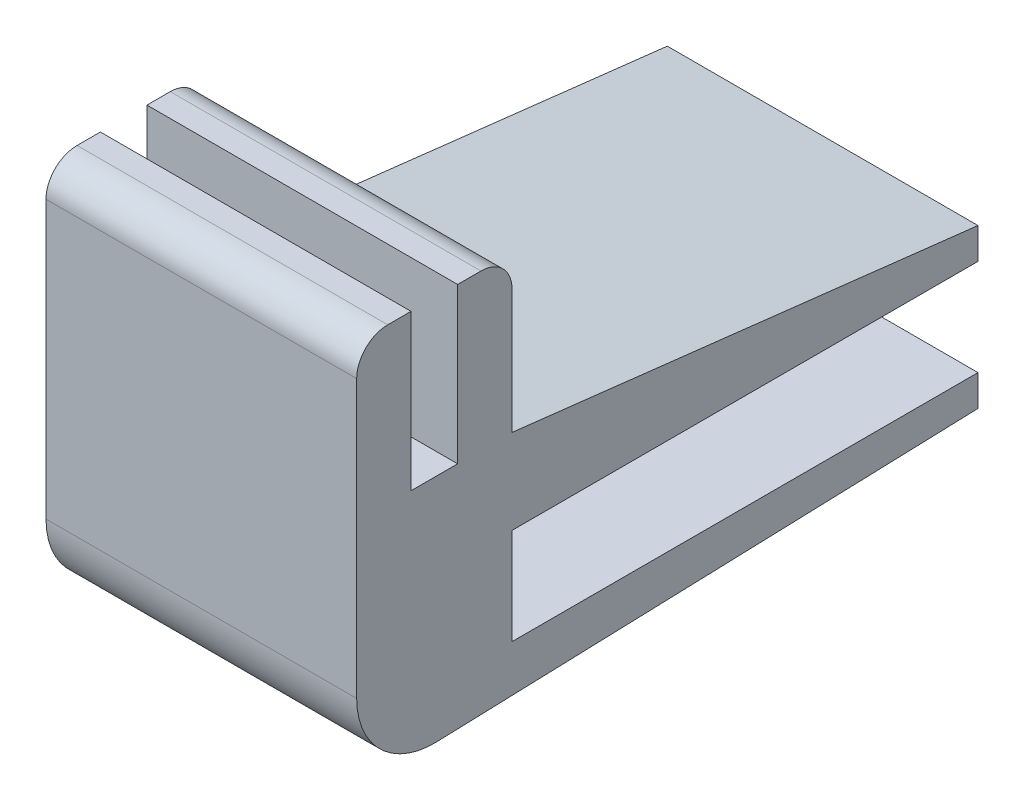
ISO-10303-21;
HEADER;
FILE_DESCRIPTION(('STEP AP214'),'2;1');
FILE_NAME('part.step','',(''),(''),'','','');
FILE_SCHEMA(('AUTOMOTIVE_DESIGN { 1 0 10303 214 1 1 1 1 }'));
ENDSEC;
DATA;
#1=APPLICATION_CONTEXT('core data for automotive mechanical design processes');
#2=APPLICATION_PROTOCOL_DEFINITION('international standard','automotive_design',2000,#1);
#3=PRODUCT_CONTEXT('',#1,'mechanical');
#4=PRODUCT('Part','Part','',(#3));
#5=PRODUCT_RELATED_PRODUCT_CATEGORY('part','',(#4));
#6=PRODUCT_DEFINITION_FORMATION('','',#4);
#7=PRODUCT_DEFINITION_CONTEXT('part definition',#1,'design');
#8=PRODUCT_DEFINITION('design','',#6,#7);
#9=PRODUCT_DEFINITION_SHAPE('','',#8);
#10=(LENGTH_UNIT() NAMED_UNIT(*) SI_UNIT(.MILLI.,.METRE.));
#11=(NAMED_UNIT(*) PLANE_ANGLE_UNIT() SI_UNIT($,.RADIAN.));
#12=(NAMED_UNIT(*) SI_UNIT($,.STERADIAN.) SOLID_ANGLE_UNIT());
#13=UNCERTAINTY_MEASURE_WITH_UNIT(LENGTH_MEASURE(1.E-05),#10,'distance_accuracy_value','');
#14=(GEOMETRIC_REPRESENTATION_CONTEXT(3) GLOBAL_UNCERTAINTY_ASSIGNED_CONTEXT((#13)) GLOBAL_UNIT_ASSIGNED_CONTEXT((#10,
#11,#12)) REPRESENTATION_CONTEXT('',''));
#15=CARTESIAN_POINT('',(0.,0.,0.));
#16=DIRECTION('',(0.,0.,1.));
#17=DIRECTION('',(1.,0.,0.));
#18=AXIS2_PLACEMENT_3D('',#15,#16,#17);
#19=CARTESIAN_POINT('',(20.,1.33556237081525,-40.));
#20=DIRECTION('',(0.,0.,1.));
#21=DIRECTION('',(1.,0.,0.));
#22=AXIS2_PLACEMENT_3D('',#19,#20,#21);
#23=PLANE('',#22);
#24=DIRECTION('',(0.,1.,0.));
#25=VECTOR('',#24,1.);
#26=CARTESIAN_POINT('',(0.,1.33556237081525,-40.));
#27=LINE('',#26,#25);
#28=CARTESIAN_POINT('',(0.,1.33556237081525,-40.));
#29=VERTEX_POINT('',#28);
#30=CARTESIAN_POINT('',(0.,3.33556237081525,-40.));
#31=VERTEX_POINT('',#30);
#32=EDGE_CURVE('E181',#29,#31,#27,.T.);
#33=ORIENTED_EDGE('',*,*,#32,.T.);
#34=DIRECTION('',(-1.,0.,0.));
#35=VECTOR('',#34,1.);
#36=CARTESIAN_POINT('',(20.,3.33556237081525,-40.));
#37=LINE('',#36,#35);
#38=CARTESIAN_POINT('',(20.,3.33556237081525,-40.));
#39=VERTEX_POINT('',#38);
#40=EDGE_CURVE('E11',#39,#31,#37,.T.);
#41=ORIENTED_EDGE('',*,*,#40,.F.);
#42=DIRECTION('',(0.,1.,0.));
#43=VECTOR('',#42,1.);
#44=CARTESIAN_POINT('',(20.,1.33556237081525,-40.));
#45=LINE('',#44,#43);
#46=CARTESIAN_POINT('',(20.,1.33556237081525,-40.));
#47=VERTEX_POINT('',#46);
#48=EDGE_CURVE('E214',#47,#39,#45,.T.);
#49=ORIENTED_EDGE('',*,*,#48,.F.);
#50=DIRECTION('',(-1.,0.,0.));
#51=VECTOR('',#50,1.);
#52=CARTESIAN_POINT('',(20.,1.33556237081525,-40.));
#53=LINE('',#52,#51);
#54=EDGE_CURVE('E177',#47,#29,#53,.T.);
#55=ORIENTED_EDGE('',*,*,#54,.T.);
#56=EDGE_LOOP('',(#33,#41,#49,#55));
#57=FACE_BOUND('',#56,.T.);
#58=ADVANCED_FACE('F32',(#57),#23,.F.);
#59=CARTESIAN_POINT('',(20.,3.33556237081525,-40.));
#60=DIRECTION('',(0.,-1.,0.));
#61=DIRECTION('',(0.,0.,-1.));
#62=AXIS2_PLACEMENT_3D('',#59,#60,#61);
#63=PLANE('',#62);
#64=DIRECTION('',(0.,0.,1.));
#65=VECTOR('',#64,1.);
#66=CARTESIAN_POINT('',(0.,3.33556237081525,-40.));
#67=LINE('',#66,#65);
#68=CARTESIAN_POINT('',(0.,3.33556237081524,-10.));
#69=VERTEX_POINT('',#68);
#70=EDGE_CURVE('E184',#31,#69,#67,.T.);
#71=ORIENTED_EDGE('',*,*,#70,.T.);
#72=DIRECTION('',(-1.,0.,0.));
#73=VECTOR('',#72,1.);
#74=CARTESIAN_POINT('',(20.,3.33556237081524,-10.));
#75=LINE('',#74,#73);
#76=CARTESIAN_POINT('',(20.,3.33556237081524,-10.));
#77=VERTEX_POINT('',#76);
#78=EDGE_CURVE('E40',#77,#69,#75,.T.);
#79=ORIENTED_EDGE('',*,*,#78,.F.);
#80=DIRECTION('',(0.,0.,1.));
#81=VECTOR('',#80,1.);
#82=CARTESIAN_POINT('',(20.,3.33556237081525,-40.));
#83=LINE('',#82,#81);
#84=EDGE_CURVE('E118',#39,#77,#83,.T.);
#85=ORIENTED_EDGE('',*,*,#84,.F.);
#86=ORIENTED_EDGE('',*,*,#40,.T.);
#87=EDGE_LOOP('',(#71,#79,#85,#86));
#88=FACE_BOUND('',#87,.T.);
#89=ADVANCED_FACE('F318',(#88),#63,.F.);
#90=CARTESIAN_POINT('',(20.,3.33556237081524,-10.));
#91=DIRECTION('',(0.,0.,1.));
#92=DIRECTION('',(1.,0.,0.));
#93=AXIS2_PLACEMENT_3D('',#90,#91,#92);
#94=PLANE('',#93);
#95=DIRECTION('',(0.,1.,0.));
#96=VECTOR('',#95,1.);
#97=CARTESIAN_POINT('',(0.,3.33556237081524,-10.));
#98=LINE('',#97,#96);
#99=CARTESIAN_POINT('',(0.,9.53556237081524,-10.));
#100=VERTEX_POINT('',#99);
#101=EDGE_CURVE('E186',#69,#100,#98,.T.);
#102=ORIENTED_EDGE('',*,*,#101,.T.);
#103=DIRECTION('',(-1.,0.,0.));
#104=VECTOR('',#103,1.);
#105=CARTESIAN_POINT('',(20.,9.53556237081524,-10.));
#106=LINE('',#105,#104);
#107=CARTESIAN_POINT('',(20.,9.53556237081524,-10.));
#108=VERTEX_POINT('',#107);
#109=EDGE_CURVE('E248',#108,#100,#106,.T.);
#110=ORIENTED_EDGE('',*,*,#109,.F.);
#111=DIRECTION('',(0.,1.,0.));
#112=VECTOR('',#111,1.);
#113=CARTESIAN_POINT('',(20.,3.33556237081524,-10.));
#114=LINE('',#113,#112);
#115=EDGE_CURVE('E256',#77,#108,#114,.T.);
#116=ORIENTED_EDGE('',*,*,#115,.F.);
#117=ORIENTED_EDGE('',*,*,#78,.T.);
#118=EDGE_LOOP('',(#102,#110,#116,#117));
#119=FACE_BOUND('',#118,.T.);
#120=ADVANCED_FACE('F254',(#119),#94,.F.);
#121=CARTESIAN_POINT('',(20.,9.53556237081524,-10.));
#122=DIRECTION('',(0.,1.,0.));
#123=DIRECTION('',(0.,0.,1.));
#124=AXIS2_PLACEMENT_3D('',#121,#122,#123);
#125=PLANE('',#124);
#126=DIRECTION('',(0.,0.,-1.));
#127=VECTOR('',#126,1.);
#128=CARTESIAN_POINT('',(0.,9.53556237081524,-10.));
#129=LINE('',#128,#127);
#130=CARTESIAN_POINT('',(0.,9.53556237081525,-40.));
#131=VERTEX_POINT('',#130);
#132=EDGE_CURVE('E188',#100,#131,#129,.T.);
#133=ORIENTED_EDGE('',*,*,#132,.T.);
#134=DIRECTION('',(-1.,0.,0.));
#135=VECTOR('',#134,1.);
#136=CARTESIAN_POINT('',(20.,9.53556237081525,-40.));
#137=LINE('',#136,#135);
#138=CARTESIAN_POINT('',(20.,9.53556237081525,-40.));
#139=VERTEX_POINT('',#138);
#140=EDGE_CURVE('E245',#139,#131,#137,.T.);
#141=ORIENTED_EDGE('',*,*,#140,.F.);
#142=DIRECTION('',(0.,0.,-1.));
#143=VECTOR('',#142,1.);
#144=CARTESIAN_POINT('',(20.,9.53556237081524,-10.));
#145=LINE('',#144,#143);
#146=EDGE_CURVE('E274',#108,#139,#145,.T.);
#147=ORIENTED_EDGE('',*,*,#146,.F.);
#148=ORIENTED_EDGE('',*,*,#109,.T.);
#149=EDGE_LOOP('',(#133,#141,#147,#148));
#150=FACE_BOUND('',#149,.T.);
#151=ADVANCED_FACE('F265',(#150),#125,.F.);
#152=CARTESIAN_POINT('',(20.,9.53556237081525,-40.));
#153=DIRECTION('',(0.,0.,1.));
#154=DIRECTION('',(1.,0.,0.));
#155=AXIS2_PLACEMENT_3D('',#152,#153,#154);
#156=PLANE('',#155);
#157=DIRECTION('',(0.,1.,0.));
#158=VECTOR('',#157,1.);
#159=CARTESIAN_POINT('',(0.,9.53556237081525,-40.));
#160=LINE('',#159,#158);
#161=CARTESIAN_POINT('',(0.,11.5355623708152,-40.));
#162=VERTEX_POINT('',#161);
#163=EDGE_CURVE('E190',#131,#162,#160,.T.);
#164=ORIENTED_EDGE('',*,*,#163,.T.);
#165=DIRECTION('',(-1.,0.,0.));
#166=VECTOR('',#165,1.);
#167=CARTESIAN_POINT('',(20.,11.5355623708152,-40.));
#168=LINE('',#167,#166);
#169=CARTESIAN_POINT('',(20.,11.5355623708152,-40.));
#170=VERTEX_POINT('',#169);
#171=EDGE_CURVE('E242',#170,#162,#168,.T.);
#172=ORIENTED_EDGE('',*,*,#171,.F.);
#173=DIRECTION('',(0.,1.,0.));
#174=VECTOR('',#173,1.);
#175=CARTESIAN_POINT('',(20.,9.53556237081525,-40.));
#176=LINE('',#175,#174);
#177=EDGE_CURVE('E271',#139,#170,#176,.T.);
#178=ORIENTED_EDGE('',*,*,#177,.F.);
#179=ORIENTED_EDGE('',*,*,#140,.T.);
#180=EDGE_LOOP('',(#164,#172,#178,#179));
#181=FACE_BOUND('',#180,.T.);
#182=ADVANCED_FACE('F269',(#181),#156,.F.);
#183=CARTESIAN_POINT('',(20.,15.,-10.));
#184=DIRECTION('',(0.,-0.993397999862923,0.1147188470494));
#185=DIRECTION('',(0.,-0.1147188470494,-0.993397999862923));
#186=AXIS2_PLACEMENT_3D('',#183,#184,#185);
#187=PLANE('',#186);
#188=DIRECTION('',(0.,0.1147188470494,0.993397999862923));
#189=VECTOR('',#188,1.);
#190=CARTESIAN_POINT('',(0.,15.,-10.));
#191=LINE('',#190,#189);
#192=CARTESIAN_POINT('',(0.,15.,-10.));
#193=VERTEX_POINT('',#192);
#194=EDGE_CURVE('E192',#162,#193,#191,.T.);
#195=ORIENTED_EDGE('',*,*,#194,.T.);
#196=DIRECTION('',(-1.,0.,0.));
#197=VECTOR('',#196,1.);
#198=CARTESIAN_POINT('',(20.,15.,-10.));
#199=LINE('',#198,#197);
#200=CARTESIAN_POINT('',(20.,15.,-10.));
#201=VERTEX_POINT('',#200);
#202=EDGE_CURVE('E239',#201,#193,#199,.T.);
#203=ORIENTED_EDGE('',*,*,#202,.F.);
#204=DIRECTION('',(0.,0.1147188470494,0.993397999862923));
#205=VECTOR('',#204,1.);
#206=CARTESIAN_POINT('',(20.,15.,-10.));
#207=LINE('',#206,#205);
#208=EDGE_CURVE('E273',#170,#201,#207,.T.);
#209=ORIENTED_EDGE('',*,*,#208,.F.);
#210=ORIENTED_EDGE('',*,*,#171,.T.);
#211=EDGE_LOOP('',(#195,#203,#209,#210));
#212=FACE_BOUND('',#211,.T.);
#213=ADVANCED_FACE('F331',(#212),#187,.F.);
#214=CARTESIAN_POINT('',(20.,15.,-10.));
#215=DIRECTION('',(0.,0.,1.));
#216=DIRECTION('',(1.,0.,0.));
#217=AXIS2_PLACEMENT_3D('',#214,#215,#216);
#218=PLANE('',#217);
#219=DIRECTION('',(0.,1.,0.));
#220=VECTOR('',#219,1.);
#221=CARTESIAN_POINT('',(0.,15.,-10.));
#222=LINE('',#221,#220);
#223=CARTESIAN_POINT('',(0.,23.,-10.));
#224=VERTEX_POINT('',#223);
#225=EDGE_CURVE('E194',#193,#224,#222,.T.);
#226=ORIENTED_EDGE('',*,*,#225,.T.);
#227=DIRECTION('',(-1.,0.,0.));
#228=VECTOR('',#227,1.);
#229=CARTESIAN_POINT('',(20.,23.,-10.));
#230=LINE('',#229,#228);
#231=CARTESIAN_POINT('',(20.,23.,-10.));
#232=VERTEX_POINT('',#231);
#233=EDGE_CURVE('E236',#232,#224,#230,.T.);
#234=ORIENTED_EDGE('',*,*,#233,.F.);
#235=DIRECTION('',(0.,1.,0.));
#236=VECTOR('',#235,1.);
#237=CARTESIAN_POINT('',(20.,15.,-10.));
#238=LINE('',#237,#236);
#239=EDGE_CURVE('E276',#201,#232,#238,.T.);
#240=ORIENTED_EDGE('',*,*,#239,.F.);
#241=ORIENTED_EDGE('',*,*,#202,.T.);
#242=EDGE_LOOP('',(#226,#234,#240,#241));
#243=FACE_BOUND('',#242,.T.);
#244=ADVANCED_FACE('F334',(#243),#218,.F.);
#245=CARTESIAN_POINT('',(20.,23.,-8.));
#246=DIRECTION('',(-1.,0.,0.));
#247=DIRECTION('',(0.,0.,1.));
#248=AXIS2_PLACEMENT_3D('',#245,#246,#247);
#249=CYLINDRICAL_SURFACE('',#248,2.);
#250=CARTESIAN_POINT('',(0.,23.,-8.));
#251=DIRECTION('',(1.,0.,0.));
#252=DIRECTION('',(0.,0.,-1.));
#253=AXIS2_PLACEMENT_3D('',#250,#251,#252);
#254=CIRCLE('',#253,2.);
#255=CARTESIAN_POINT('',(0.,25.,-7.99999999999999));
#256=VERTEX_POINT('',#255);
#257=EDGE_CURVE('E196',#224,#256,#254,.T.);
#258=ORIENTED_EDGE('',*,*,#257,.T.);
#259=DIRECTION('',(-1.,0.,0.));
#260=VECTOR('',#259,1.);
#261=CARTESIAN_POINT('',(20.,25.,-7.99999999999999));
#262=LINE('',#261,#260);
#263=CARTESIAN_POINT('',(20.,25.,-7.99999999999999));
#264=VERTEX_POINT('',#263);
#265=EDGE_CURVE('E233',#264,#256,#262,.T.);
#266=ORIENTED_EDGE('',*,*,#265,.F.);
#267=CARTESIAN_POINT('',(20.,23.,-8.));
#268=DIRECTION('',(1.,0.,0.));
#269=DIRECTION('',(0.,0.,-1.));
#270=AXIS2_PLACEMENT_3D('',#267,#268,#269);
#271=CIRCLE('',#270,2.);
#272=EDGE_CURVE('E282',#232,#264,#271,.T.);
#273=ORIENTED_EDGE('',*,*,#272,.F.);
#274=ORIENTED_EDGE('',*,*,#233,.T.);
#275=EDGE_LOOP('',(#258,#266,#273,#274));
#276=FACE_BOUND('',#275,.T.);
#277=ADVANCED_FACE('F338',(#276),#249,.T.);
#278=CARTESIAN_POINT('',(20.,25.,-7.99999999999999));
#279=DIRECTION('',(0.,-1.,0.));
#280=DIRECTION('',(0.,0.,-1.));
#281=AXIS2_PLACEMENT_3D('',#278,#279,#280);
#282=PLANE('',#281);
#283=DIRECTION('',(0.,0.,1.));
#284=VECTOR('',#283,1.);
#285=CARTESIAN_POINT('',(0.,25.,-7.99999999999999));
#286=LINE('',#285,#284);
#287=CARTESIAN_POINT('',(0.,25.,-6.5));
#288=VERTEX_POINT('',#287);
#289=EDGE_CURVE('E198',#256,#288,#286,.T.);
#290=ORIENTED_EDGE('',*,*,#289,.T.);
#291=DIRECTION('',(-1.,0.,0.));
#292=VECTOR('',#291,1.);
#293=CARTESIAN_POINT('',(20.,25.,-6.5));
#294=LINE('',#293,#292);
#295=CARTESIAN_POINT('',(20.,25.,-6.5));
#296=VERTEX_POINT('',#295);
#297=EDGE_CURVE('E230',#296,#288,#294,.T.);
#298=ORIENTED_EDGE('',*,*,#297,.F.);
#299=DIRECTION('',(0.,0.,1.));
#300=VECTOR('',#299,1.);
#301=CARTESIAN_POINT('',(20.,25.,-7.99999999999999));
#302=LINE('',#301,#300);
#303=EDGE_CURVE('E284',#264,#296,#302,.T.);
#304=ORIENTED_EDGE('',*,*,#303,.F.);
#305=ORIENTED_EDGE('',*,*,#265,.T.);
#306=EDGE_LOOP('',(#290,#298,#304,#305));
#307=FACE_BOUND('',#306,.T.);
#308=ADVANCED_FACE('F342',(#307),#282,.F.);
#309=CARTESIAN_POINT('',(20.,25.,-6.5));
#310=DIRECTION('',(0.,0.,-1.));
#311=DIRECTION('',(-1.,0.,0.));
#312=AXIS2_PLACEMENT_3D('',#309,#310,#311);
#313=PLANE('',#312);
#314=DIRECTION('',(0.,-1.,0.));
#315=VECTOR('',#314,1.);
#316=CARTESIAN_POINT('',(0.,25.,-6.5));
#317=LINE('',#316,#315);
#318=CARTESIAN_POINT('',(0.,15.,-6.5));
#319=VERTEX_POINT('',#318);
#320=EDGE_CURVE('E200',#288,#319,#317,.T.);
#321=ORIENTED_EDGE('',*,*,#320,.T.);
#322=DIRECTION('',(-1.,0.,0.));
#323=VECTOR('',#322,1.);
#324=CARTESIAN_POINT('',(20.,15.,-6.5));
#325=LINE('',#324,#323);
#326=CARTESIAN_POINT('',(20.,15.,-6.5));
#327=VERTEX_POINT('',#326);
#328=EDGE_CURVE('E227',#327,#319,#325,.T.);
#329=ORIENTED_EDGE('',*,*,#328,.F.);
#330=DIRECTION('',(0.,-1.,0.));
#331=VECTOR('',#330,1.);
#332=CARTESIAN_POINT('',(20.,25.,-6.5));
#333=LINE('',#332,#331);
#334=EDGE_CURVE('E286',#296,#327,#333,.T.);
#335=ORIENTED_EDGE('',*,*,#334,.F.);
#336=ORIENTED_EDGE('',*,*,#297,.T.);
#337=EDGE_LOOP('',(#321,#329,#335,#336));
#338=FACE_BOUND('',#337,.T.);
#339=ADVANCED_FACE('F346',(#338),#313,.F.);
#340=CARTESIAN_POINT('',(20.,15.,-6.5));
#341=DIRECTION('',(0.,-1.,0.));
#342=DIRECTION('',(0.,0.,-1.));
#343=AXIS2_PLACEMENT_3D('',#340,#341,#342);
#344=PLANE('',#343);
#345=DIRECTION('',(0.,0.,1.));
#346=VECTOR('',#345,1.);
#347=CARTESIAN_POINT('',(0.,15.,-6.5));
#348=LINE('',#347,#346);
#349=CARTESIAN_POINT('',(0.,15.,-3.5));
#350=VERTEX_POINT('',#349);
#351=EDGE_CURVE('E202',#319,#350,#348,.T.);
#352=ORIENTED_EDGE('',*,*,#351,.T.);
#353=DIRECTION('',(-1.,0.,0.));
#354=VECTOR('',#353,1.);
#355=CARTESIAN_POINT('',(20.,15.,-3.5));
#356=LINE('',#355,#354);
#357=CARTESIAN_POINT('',(20.,15.,-3.5));
#358=VERTEX_POINT('',#357);
#359=EDGE_CURVE('E224',#358,#350,#356,.T.);
#360=ORIENTED_EDGE('',*,*,#359,.F.);
#361=DIRECTION('',(0.,0.,1.));
#362=VECTOR('',#361,1.);
#363=CARTESIAN_POINT('',(20.,15.,-6.5));
#364=LINE('',#363,#362);
#365=EDGE_CURVE('E288',#327,#358,#364,.T.);
#366=ORIENTED_EDGE('',*,*,#365,.F.);
#367=ORIENTED_EDGE('',*,*,#328,.T.);
#368=EDGE_LOOP('',(#352,#360,#366,#367));
#369=FACE_BOUND('',#368,.T.);
#370=ADVANCED_FACE('F350',(#369),#344,.F.);
#371=CARTESIAN_POINT('',(20.,15.,-3.5));
#372=DIRECTION('',(0.,0.,1.));
#373=DIRECTION('',(1.,0.,0.));
#374=AXIS2_PLACEMENT_3D('',#371,#372,#373);
#375=PLANE('',#374);
#376=DIRECTION('',(0.,1.,0.));
#377=VECTOR('',#376,1.);
#378=CARTESIAN_POINT('',(0.,15.,-3.5));
#379=LINE('',#378,#377);
#380=CARTESIAN_POINT('',(0.,25.,-3.5));
#381=VERTEX_POINT('',#380);
#382=EDGE_CURVE('E204',#350,#381,#379,.T.);
#383=ORIENTED_EDGE('',*,*,#382,.T.);
#384=DIRECTION('',(-1.,0.,0.));
#385=VECTOR('',#384,1.);
#386=CARTESIAN_POINT('',(20.,25.,-3.5));
#387=LINE('',#386,#385);
#388=CARTESIAN_POINT('',(20.,25.,-3.5));
#389=VERTEX_POINT('',#388);
#390=EDGE_CURVE('E221',#389,#381,#387,.T.);
#391=ORIENTED_EDGE('',*,*,#390,.F.);
#392=DIRECTION('',(0.,1.,0.));
#393=VECTOR('',#392,1.);
#394=CARTESIAN_POINT('',(20.,15.,-3.5));
#395=LINE('',#394,#393);
#396=EDGE_CURVE('E290',#358,#389,#395,.T.);
#397=ORIENTED_EDGE('',*,*,#396,.F.);
#398=ORIENTED_EDGE('',*,*,#359,.T.);
#399=EDGE_LOOP('',(#383,#391,#397,#398));
#400=FACE_BOUND('',#399,.T.);
#401=ADVANCED_FACE('F354',(#400),#375,.F.);
#402=CARTESIAN_POINT('',(20.,25.,-3.5));
#403=DIRECTION('',(0.,-1.,0.));
#404=DIRECTION('',(0.,0.,-1.));
#405=AXIS2_PLACEMENT_3D('',#402,#403,#404);
#406=PLANE('',#405);
#407=DIRECTION('',(0.,0.,1.));
#408=VECTOR('',#407,1.);
#409=CARTESIAN_POINT('',(0.,25.,-3.5));
#410=LINE('',#409,#408);
#411=CARTESIAN_POINT('',(0.,25.,-2.00000000000001));
#412=VERTEX_POINT('',#411);
#413=EDGE_CURVE('E206',#381,#412,#410,.T.);
#414=ORIENTED_EDGE('',*,*,#413,.T.);
#415=DIRECTION('',(-1.,0.,0.));
#416=VECTOR('',#415,1.);
#417=CARTESIAN_POINT('',(20.,25.,-2.00000000000001));
#418=LINE('',#417,#416);
#419=CARTESIAN_POINT('',(20.,25.,-2.00000000000001));
#420=VERTEX_POINT('',#419);
#421=EDGE_CURVE('E218',#420,#412,#418,.T.);
#422=ORIENTED_EDGE('',*,*,#421,.F.);
#423=DIRECTION('',(0.,0.,1.));
#424=VECTOR('',#423,1.);
#425=CARTESIAN_POINT('',(20.,25.,-3.5));
#426=LINE('',#425,#424);
#427=EDGE_CURVE('E292',#389,#420,#426,.T.);
#428=ORIENTED_EDGE('',*,*,#427,.F.);
#429=ORIENTED_EDGE('',*,*,#390,.T.);
#430=EDGE_LOOP('',(#414,#422,#428,#429));
#431=FACE_BOUND('',#430,.T.);
#432=ADVANCED_FACE('F298',(#431),#406,.F.);
#433=CARTESIAN_POINT('',(20.,23.,-2.));
#434=DIRECTION('',(-1.,0.,0.));
#435=DIRECTION('',(0.,0.,1.));
#436=AXIS2_PLACEMENT_3D('',#433,#434,#435);
#437=CYLINDRICAL_SURFACE('',#436,2.);
#438=CARTESIAN_POINT('',(0.,23.,-2.));
#439=DIRECTION('',(1.,0.,0.));
#440=DIRECTION('',(0.,0.,1.));
#441=AXIS2_PLACEMENT_3D('',#438,#439,#440);
#442=CIRCLE('',#441,2.);
#443=CARTESIAN_POINT('',(0.,23.,0.));
#444=VERTEX_POINT('',#443);
#445=EDGE_CURVE('E208',#412,#444,#442,.T.);
#446=ORIENTED_EDGE('',*,*,#445,.T.);
#447=DIRECTION('',(-1.,0.,0.));
#448=VECTOR('',#447,1.);
#449=CARTESIAN_POINT('',(20.,23.,0.));
#450=LINE('',#449,#448);
#451=CARTESIAN_POINT('',(20.,23.,0.));
#452=VERTEX_POINT('',#451);
#453=EDGE_CURVE('E172',#452,#444,#450,.T.);
#454=ORIENTED_EDGE('',*,*,#453,.F.);
#455=CARTESIAN_POINT('',(20.,23.,-2.));
#456=DIRECTION('',(1.,0.,0.));
#457=DIRECTION('',(0.,0.,1.));
#458=AXIS2_PLACEMENT_3D('',#455,#456,#457);
#459=CIRCLE('',#458,2.);
#460=EDGE_CURVE('E164',#420,#452,#459,.T.);
#461=ORIENTED_EDGE('',*,*,#460,.F.);
#462=ORIENTED_EDGE('',*,*,#421,.T.);
#463=EDGE_LOOP('',(#446,#454,#461,#462));
#464=FACE_BOUND('',#463,.T.);
#465=ADVANCED_FACE('F302',(#464),#437,.T.);
#466=CARTESIAN_POINT('',(20.,15.,0.));
#467=DIRECTION('',(0.,0.,-1.));
#468=DIRECTION('',(0.,1.,0.));
#469=AXIS2_PLACEMENT_3D('',#466,#467,#468);
#470=PLANE('',#469);
#471=DIRECTION('',(0.,-1.,0.));
#472=VECTOR('',#471,1.);
#473=CARTESIAN_POINT('',(0.,15.,0.));
#474=LINE('',#473,#472);
#475=CARTESIAN_POINT('',(0.,5.16973159320433,0.));
#476=VERTEX_POINT('',#475);
#477=EDGE_CURVE('E171',#444,#476,#474,.T.);
#478=ORIENTED_EDGE('',*,*,#477,.T.);
#479=DIRECTION('',(-1.,0.,0.));
#480=VECTOR('',#479,1.);
#481=CARTESIAN_POINT('',(20.,5.16973159320433,0.));
#482=LINE('',#481,#480);
#483=CARTESIAN_POINT('',(20.,5.16973159320433,0.));
#484=VERTEX_POINT('',#483);
#485=EDGE_CURVE('E169',#484,#476,#482,.T.);
#486=ORIENTED_EDGE('',*,*,#485,.F.);
#487=DIRECTION('',(0.,-1.,0.));
#488=VECTOR('',#487,1.);
#489=CARTESIAN_POINT('',(20.,15.,0.));
#490=LINE('',#489,#488);
#491=EDGE_CURVE('E158',#452,#484,#490,.T.);
#492=ORIENTED_EDGE('',*,*,#491,.F.);
#493=ORIENTED_EDGE('',*,*,#453,.T.);
#494=EDGE_LOOP('',(#478,#486,#492,#493));
#495=FACE_BOUND('',#494,.T.);
#496=ADVANCED_FACE('F170',(#495),#470,.F.);
#497=CARTESIAN_POINT('',(20.,5.16973159320429,-5.));
#498=DIRECTION('',(-1.,0.,0.));
#499=DIRECTION('',(0.,0.,1.));
#500=AXIS2_PLACEMENT_3D('',#497,#498,#499);
#501=CYLINDRICAL_SURFACE('',#500,5.);
#502=CARTESIAN_POINT('',(0.,5.16973159320429,-5.));
#503=DIRECTION('',(1.,0.,0.));
#504=DIRECTION('',(0.,0.,1.));
#505=AXIS2_PLACEMENT_3D('',#502,#503,#504);
#506=CIRCLE('',#505,5.);
#507=CARTESIAN_POINT('',(0.,0.172516338231421,-5.16685231633518));
#508=VERTEX_POINT('',#507);
#509=EDGE_CURVE('E104',#476,#508,#506,.T.);
#510=ORIENTED_EDGE('',*,*,#509,.T.);
#511=DIRECTION('',(-1.,0.,0.));
#512=VECTOR('',#511,1.);
#513=CARTESIAN_POINT('',(20.,0.172516338231421,-5.16685231633518));
#514=LINE('',#513,#512);
#515=CARTESIAN_POINT('',(20.,0.172516338231421,-5.16685231633518));
#516=VERTEX_POINT('',#515);
#517=EDGE_CURVE('E173',#516,#508,#514,.T.);
#518=ORIENTED_EDGE('',*,*,#517,.F.);
#519=CARTESIAN_POINT('',(20.,5.16973159320429,-5.));
#520=DIRECTION('',(1.,0.,0.));
#521=DIRECTION('',(0.,0.,1.));
#522=AXIS2_PLACEMENT_3D('',#519,#520,#521);
#523=CIRCLE('',#522,5.);
#524=EDGE_CURVE('E162',#484,#516,#523,.T.);
#525=ORIENTED_EDGE('',*,*,#524,.F.);
#526=ORIENTED_EDGE('',*,*,#485,.T.);
#527=EDGE_LOOP('',(#510,#518,#525,#526));
#528=FACE_BOUND('',#527,.T.);
#529=ADVANCED_FACE('F175',(#528),#501,.T.);
#530=CARTESIAN_POINT('',(20.,0.172516338231421,-5.16685231633518));
#531=DIRECTION('',(0.,0.999443050994575,0.0333704632670284));
#532=DIRECTION('',(0.,-0.0333704632670284,0.999443050994575));
#533=AXIS2_PLACEMENT_3D('',#530,#531,#532);
#534=PLANE('',#533);
#535=DIRECTION('',(0.,0.0333704632670284,-0.999443050994575));
#536=VECTOR('',#535,1.);
#537=CARTESIAN_POINT('',(0.,0.172516338231421,-5.16685231633518));
#538=LINE('',#537,#536);
#539=EDGE_CURVE('E110',#508,#29,#538,.T.);
#540=ORIENTED_EDGE('',*,*,#539,.T.);
#541=ORIENTED_EDGE('',*,*,#54,.F.);
#542=DIRECTION('',(0.,0.0333704632670284,-0.999443050994575));
#543=VECTOR('',#542,1.);
#544=CARTESIAN_POINT('',(20.,0.172516338231421,-5.16685231633518));
#545=LINE('',#544,#543);
#546=EDGE_CURVE('E48',#516,#47,#545,.T.);
#547=ORIENTED_EDGE('',*,*,#546,.F.);
#548=ORIENTED_EDGE('',*,*,#517,.T.);
#549=EDGE_LOOP('',(#540,#541,#547,#548));
#550=FACE_BOUND('',#549,.T.);
#551=ADVANCED_FACE('F307',(#550),#534,.F.);
#552=CARTESIAN_POINT('',(20.,23.,-8.));
#553=DIRECTION('',(1.,0.,0.));
#554=DIRECTION('',(0.,0.,-1.));
#555=AXIS2_PLACEMENT_3D('',#552,#553,#554);
#556=PLANE('',#555);
#557=ORIENTED_EDGE('',*,*,#48,.T.);
#558=ORIENTED_EDGE('',*,*,#84,.T.);
#559=ORIENTED_EDGE('',*,*,#115,.T.);
#560=ORIENTED_EDGE('',*,*,#146,.T.);
#561=ORIENTED_EDGE('',*,*,#177,.T.);
#562=ORIENTED_EDGE('',*,*,#208,.T.);
#563=ORIENTED_EDGE('',*,*,#239,.T.);
#564=ORIENTED_EDGE('',*,*,#272,.T.);
#565=ORIENTED_EDGE('',*,*,#303,.T.);
#566=ORIENTED_EDGE('',*,*,#334,.T.);
#567=ORIENTED_EDGE('',*,*,#365,.T.);
#568=ORIENTED_EDGE('',*,*,#396,.T.);
#569=ORIENTED_EDGE('',*,*,#427,.T.);
#570=ORIENTED_EDGE('',*,*,#460,.T.);
#571=ORIENTED_EDGE('',*,*,#491,.T.);
#572=ORIENTED_EDGE('',*,*,#524,.T.);
#573=ORIENTED_EDGE('',*,*,#546,.T.);
#574=EDGE_LOOP('',(#557,#558,#559,#560,#561,#562,#563,#564,#565,#566,#567,#568,#569,#570,#571,
#572,#573));
#575=FACE_BOUND('',#574,.T.);
#576=ADVANCED_FACE('F160',(#575),#556,.T.);
#577=CARTESIAN_POINT('',(0.,23.,-8.));
#578=DIRECTION('',(1.,0.,0.));
#579=DIRECTION('',(0.,0.,-1.));
#580=AXIS2_PLACEMENT_3D('',#577,#578,#579);
#581=PLANE('',#580);
#582=ORIENTED_EDGE('',*,*,#32,.F.);
#583=ORIENTED_EDGE('',*,*,#539,.F.);
#584=ORIENTED_EDGE('',*,*,#509,.F.);
#585=ORIENTED_EDGE('',*,*,#477,.F.);
#586=ORIENTED_EDGE('',*,*,#445,.F.);
#587=ORIENTED_EDGE('',*,*,#413,.F.);
#588=ORIENTED_EDGE('',*,*,#382,.F.);
#589=ORIENTED_EDGE('',*,*,#351,.F.);
#590=ORIENTED_EDGE('',*,*,#320,.F.);
#591=ORIENTED_EDGE('',*,*,#289,.F.);
#592=ORIENTED_EDGE('',*,*,#257,.F.);
#593=ORIENTED_EDGE('',*,*,#225,.F.);
#594=ORIENTED_EDGE('',*,*,#194,.F.);
#595=ORIENTED_EDGE('',*,*,#163,.F.);
#596=ORIENTED_EDGE('',*,*,#132,.F.);
#597=ORIENTED_EDGE('',*,*,#101,.F.);
#598=ORIENTED_EDGE('',*,*,#70,.F.);
#599=EDGE_LOOP('',(#582,#583,#584,#585,#586,#587,#588,#589,#590,#591,#592,#593,#594,#595,#596,
#597,#598));
#600=FACE_BOUND('',#599,.T.);
#601=ADVANCED_FACE('F260',(#600),#581,.F.);
#602=CLOSED_SHELL('',(#58,#89,#120,#151,#182,#213,#244,#277,#308,#339,#370,#401,#432,#465,#496,
#529,#551,#576,#601));
#603=MANIFOLD_SOLID_BREP('B2',#602);
#604=ADVANCED_BREP_SHAPE_REPRESENTATION('',(#18,#603),#14);
#605=SHAPE_DEFINITION_REPRESENTATION(#9,#604);
ENDSEC;
END-ISO-10303-21;
